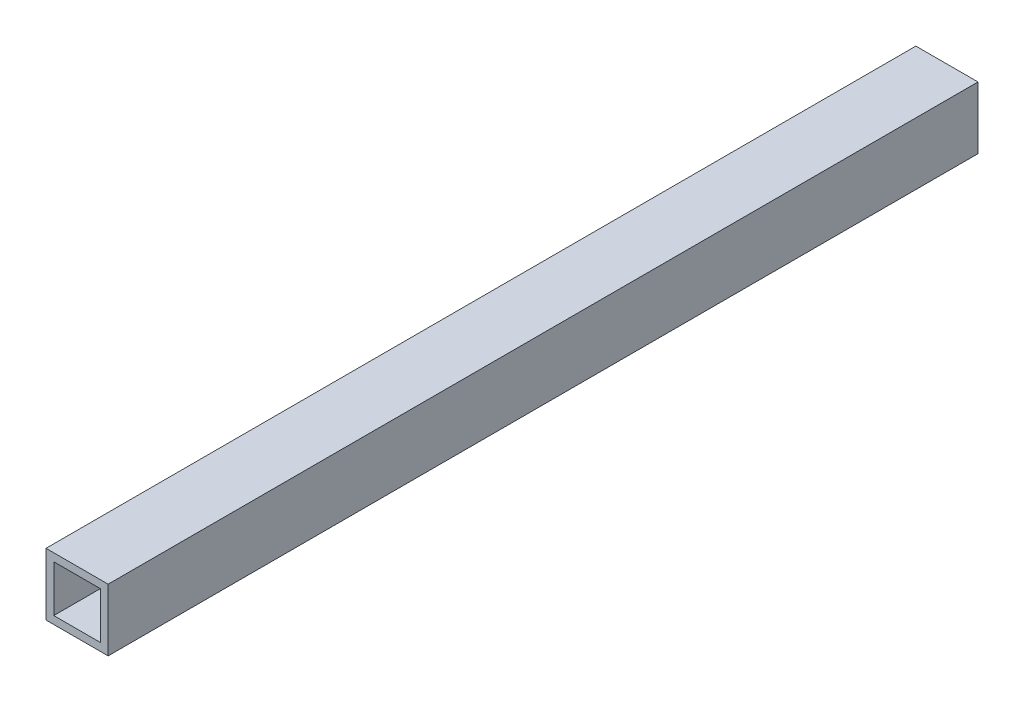
ISO-10303-21;
HEADER;
FILE_DESCRIPTION(('STEP AP214'),'2;1');
FILE_NAME('part.step','',(''),(''),'','','');
FILE_SCHEMA(('AUTOMOTIVE_DESIGN { 1 0 10303 214 1 1 1 1 }'));
ENDSEC;
DATA;
#1=APPLICATION_CONTEXT('core data for automotive mechanical design processes');
#2=APPLICATION_PROTOCOL_DEFINITION('international standard','automotive_design',2000,#1);
#3=PRODUCT_CONTEXT('',#1,'mechanical');
#4=PRODUCT('Part','Part','',(#3));
#5=PRODUCT_RELATED_PRODUCT_CATEGORY('part','',(#4));
#6=PRODUCT_DEFINITION_FORMATION('','',#4);
#7=PRODUCT_DEFINITION_CONTEXT('part definition',#1,'design');
#8=PRODUCT_DEFINITION('design','',#6,#7);
#9=PRODUCT_DEFINITION_SHAPE('','',#8);
#10=(LENGTH_UNIT() NAMED_UNIT(*) SI_UNIT(.MILLI.,.METRE.));
#11=(NAMED_UNIT(*) PLANE_ANGLE_UNIT() SI_UNIT($,.RADIAN.));
#12=(NAMED_UNIT(*) SI_UNIT($,.STERADIAN.) SOLID_ANGLE_UNIT());
#13=UNCERTAINTY_MEASURE_WITH_UNIT(LENGTH_MEASURE(1.E-05),#10,'distance_accuracy_value','');
#14=(GEOMETRIC_REPRESENTATION_CONTEXT(3) GLOBAL_UNCERTAINTY_ASSIGNED_CONTEXT((#13)) GLOBAL_UNIT_ASSIGNED_CONTEXT((#10,
#11,#12)) REPRESENTATION_CONTEXT('',''));
#15=CARTESIAN_POINT('',(0.,0.,0.));
#16=DIRECTION('',(0.,0.,1.));
#17=DIRECTION('',(1.,0.,0.));
#18=AXIS2_PLACEMENT_3D('',#15,#16,#17);
#19=CARTESIAN_POINT('',(0.,0.,177.8));
#20=DIRECTION('',(0.,0.,1.));
#21=DIRECTION('',(1.,0.,0.));
#22=AXIS2_PLACEMENT_3D('',#19,#20,#21);
#23=PLANE('',#22);
#24=DIRECTION('',(0.,-1.,0.));
#25=VECTOR('',#24,1.);
#26=CARTESIAN_POINT('',(-12.7,-12.7,177.8));
#27=LINE('',#26,#25);
#28=CARTESIAN_POINT('',(-12.7,12.7,177.8));
#29=VERTEX_POINT('',#28);
#30=CARTESIAN_POINT('',(-12.7,-12.7,177.8));
#31=VERTEX_POINT('',#30);
#32=EDGE_CURVE('E112',#29,#31,#27,.T.);
#33=ORIENTED_EDGE('',*,*,#32,.T.);
#34=DIRECTION('',(1.,0.,0.));
#35=VECTOR('',#34,1.);
#36=CARTESIAN_POINT('',(12.7,-12.7,177.8));
#37=LINE('',#36,#35);
#38=CARTESIAN_POINT('',(12.7,-12.7,177.8));
#39=VERTEX_POINT('',#38);
#40=EDGE_CURVE('E155',#31,#39,#37,.T.);
#41=ORIENTED_EDGE('',*,*,#40,.T.);
#42=DIRECTION('',(0.,1.,0.));
#43=VECTOR('',#42,1.);
#44=CARTESIAN_POINT('',(12.7,-12.7,177.8));
#45=LINE('',#44,#43);
#46=CARTESIAN_POINT('',(12.7,12.7,177.8));
#47=VERTEX_POINT('',#46);
#48=EDGE_CURVE('E157',#39,#47,#45,.T.);
#49=ORIENTED_EDGE('',*,*,#48,.T.);
#50=DIRECTION('',(-1.,0.,0.));
#51=VECTOR('',#50,1.);
#52=CARTESIAN_POINT('',(12.7,12.7,177.8));
#53=LINE('',#52,#51);
#54=EDGE_CURVE('E59',#47,#29,#53,.T.);
#55=ORIENTED_EDGE('',*,*,#54,.T.);
#56=EDGE_LOOP('',(#33,#41,#49,#55));
#57=FACE_BOUND('',#56,.T.);
#58=DIRECTION('',(1.,0.,0.));
#59=VECTOR('',#58,1.);
#60=CARTESIAN_POINT('',(9.525,-9.525,177.8));
#61=LINE('',#60,#59);
#62=CARTESIAN_POINT('',(-9.52499999999999,-9.525,177.8));
#63=VERTEX_POINT('',#62);
#64=CARTESIAN_POINT('',(9.525,-9.525,177.8));
#65=VERTEX_POINT('',#64);
#66=EDGE_CURVE('E144',#63,#65,#61,.T.);
#67=ORIENTED_EDGE('',*,*,#66,.F.);
#68=DIRECTION('',(0.,-1.,0.));
#69=VECTOR('',#68,1.);
#70=CARTESIAN_POINT('',(-9.52499999999999,-9.525,177.8));
#71=LINE('',#70,#69);
#72=CARTESIAN_POINT('',(-9.52499999999999,9.525,177.8));
#73=VERTEX_POINT('',#72);
#74=EDGE_CURVE('E109',#73,#63,#71,.T.);
#75=ORIENTED_EDGE('',*,*,#74,.F.);
#76=DIRECTION('',(-1.,0.,0.));
#77=VECTOR('',#76,1.);
#78=CARTESIAN_POINT('',(9.525,9.525,177.8));
#79=LINE('',#78,#77);
#80=CARTESIAN_POINT('',(9.525,9.525,177.8));
#81=VERTEX_POINT('',#80);
#82=EDGE_CURVE('E148',#81,#73,#79,.T.);
#83=ORIENTED_EDGE('',*,*,#82,.F.);
#84=DIRECTION('',(0.,1.,0.));
#85=VECTOR('',#84,1.);
#86=CARTESIAN_POINT('',(9.525,-9.525,177.8));
#87=LINE('',#86,#85);
#88=EDGE_CURVE('E146',#65,#81,#87,.T.);
#89=ORIENTED_EDGE('',*,*,#88,.F.);
#90=EDGE_LOOP('',(#67,#75,#83,#89));
#91=FACE_BOUND('',#90,.T.);
#92=ADVANCED_FACE('F36',(#57,#91),#23,.T.);
#93=CARTESIAN_POINT('',(-12.7,-12.7,177.8));
#94=DIRECTION('',(1.,0.,0.));
#95=DIRECTION('',(0.,0.,-1.));
#96=AXIS2_PLACEMENT_3D('',#93,#94,#95);
#97=PLANE('',#96);
#98=DIRECTION('',(0.,0.,-1.));
#99=VECTOR('',#98,1.);
#100=CARTESIAN_POINT('',(-12.7,12.7,177.8));
#101=LINE('',#100,#99);
#102=CARTESIAN_POINT('',(-12.7,12.7,-177.8));
#103=VERTEX_POINT('',#102);
#104=EDGE_CURVE('E160',#29,#103,#101,.T.);
#105=ORIENTED_EDGE('',*,*,#104,.T.);
#106=DIRECTION('',(0.,-1.,0.));
#107=VECTOR('',#106,1.);
#108=CARTESIAN_POINT('',(-12.7,-12.7,-177.8));
#109=LINE('',#108,#107);
#110=CARTESIAN_POINT('',(-12.7,-12.7,-177.8));
#111=VERTEX_POINT('',#110);
#112=EDGE_CURVE('E131',#103,#111,#109,.T.);
#113=ORIENTED_EDGE('',*,*,#112,.T.);
#114=DIRECTION('',(0.,0.,-1.));
#115=VECTOR('',#114,1.);
#116=CARTESIAN_POINT('',(-12.7,-12.7,177.8));
#117=LINE('',#116,#115);
#118=EDGE_CURVE('E11',#31,#111,#117,.T.);
#119=ORIENTED_EDGE('',*,*,#118,.F.);
#120=ORIENTED_EDGE('',*,*,#32,.F.);
#121=EDGE_LOOP('',(#105,#113,#119,#120));
#122=FACE_BOUND('',#121,.T.);
#123=ADVANCED_FACE('F38',(#122),#97,.F.);
#124=CARTESIAN_POINT('',(12.7,-12.7,177.8));
#125=DIRECTION('',(0.,1.,0.));
#126=DIRECTION('',(0.,0.,1.));
#127=AXIS2_PLACEMENT_3D('',#124,#125,#126);
#128=PLANE('',#127);
#129=ORIENTED_EDGE('',*,*,#118,.T.);
#130=DIRECTION('',(1.,0.,0.));
#131=VECTOR('',#130,1.);
#132=CARTESIAN_POINT('',(12.7,-12.7,-177.8));
#133=LINE('',#132,#131);
#134=CARTESIAN_POINT('',(12.7,-12.7,-177.8));
#135=VERTEX_POINT('',#134);
#136=EDGE_CURVE('E134',#111,#135,#133,.T.);
#137=ORIENTED_EDGE('',*,*,#136,.T.);
#138=DIRECTION('',(0.,0.,-1.));
#139=VECTOR('',#138,1.);
#140=CARTESIAN_POINT('',(12.7,-12.7,177.8));
#141=LINE('',#140,#139);
#142=EDGE_CURVE('E44',#39,#135,#141,.T.);
#143=ORIENTED_EDGE('',*,*,#142,.F.);
#144=ORIENTED_EDGE('',*,*,#40,.F.);
#145=EDGE_LOOP('',(#129,#137,#143,#144));
#146=FACE_BOUND('',#145,.T.);
#147=ADVANCED_FACE('F173',(#146),#128,.F.);
#148=CARTESIAN_POINT('',(12.7,-12.7,177.8));
#149=DIRECTION('',(-1.,0.,0.));
#150=DIRECTION('',(0.,0.,1.));
#151=AXIS2_PLACEMENT_3D('',#148,#149,#150);
#152=PLANE('',#151);
#153=ORIENTED_EDGE('',*,*,#142,.T.);
#154=DIRECTION('',(0.,1.,0.));
#155=VECTOR('',#154,1.);
#156=CARTESIAN_POINT('',(12.7,-12.7,-177.8));
#157=LINE('',#156,#155);
#158=CARTESIAN_POINT('',(12.7,12.7,-177.8));
#159=VERTEX_POINT('',#158);
#160=EDGE_CURVE('E137',#135,#159,#157,.T.);
#161=ORIENTED_EDGE('',*,*,#160,.T.);
#162=DIRECTION('',(0.,0.,-1.));
#163=VECTOR('',#162,1.);
#164=CARTESIAN_POINT('',(12.7,12.7,177.8));
#165=LINE('',#164,#163);
#166=EDGE_CURVE('E162',#47,#159,#165,.T.);
#167=ORIENTED_EDGE('',*,*,#166,.F.);
#168=ORIENTED_EDGE('',*,*,#48,.F.);
#169=EDGE_LOOP('',(#153,#161,#167,#168));
#170=FACE_BOUND('',#169,.T.);
#171=ADVANCED_FACE('F167',(#170),#152,.F.);
#172=CARTESIAN_POINT('',(12.7,12.7,177.8));
#173=DIRECTION('',(0.,-1.,0.));
#174=DIRECTION('',(0.,0.,-1.));
#175=AXIS2_PLACEMENT_3D('',#172,#173,#174);
#176=PLANE('',#175);
#177=ORIENTED_EDGE('',*,*,#166,.T.);
#178=DIRECTION('',(-1.,0.,0.));
#179=VECTOR('',#178,1.);
#180=CARTESIAN_POINT('',(12.7,12.7,-177.8));
#181=LINE('',#180,#179);
#182=EDGE_CURVE('E140',#159,#103,#181,.T.);
#183=ORIENTED_EDGE('',*,*,#182,.T.);
#184=ORIENTED_EDGE('',*,*,#104,.F.);
#185=ORIENTED_EDGE('',*,*,#54,.F.);
#186=EDGE_LOOP('',(#177,#183,#184,#185));
#187=FACE_BOUND('',#186,.T.);
#188=ADVANCED_FACE('F178',(#187),#176,.F.);
#189=CARTESIAN_POINT('',(-9.52499999999999,-9.525,177.8));
#190=DIRECTION('',(1.,0.,0.));
#191=DIRECTION('',(0.,0.,-1.));
#192=AXIS2_PLACEMENT_3D('',#189,#190,#191);
#193=PLANE('',#192);
#194=DIRECTION('',(0.,0.,-1.));
#195=VECTOR('',#194,1.);
#196=CARTESIAN_POINT('',(-9.52499999999999,-9.525,177.8));
#197=LINE('',#196,#195);
#198=CARTESIAN_POINT('',(-9.52499999999999,-9.525,-177.8));
#199=VERTEX_POINT('',#198);
#200=EDGE_CURVE('E101',#63,#199,#197,.T.);
#201=ORIENTED_EDGE('',*,*,#200,.T.);
#202=DIRECTION('',(0.,-1.,0.));
#203=VECTOR('',#202,1.);
#204=CARTESIAN_POINT('',(-9.52499999999999,-9.525,-177.8));
#205=LINE('',#204,#203);
#206=CARTESIAN_POINT('',(-9.52499999999999,9.525,-177.8));
#207=VERTEX_POINT('',#206);
#208=EDGE_CURVE('E106',#207,#199,#205,.T.);
#209=ORIENTED_EDGE('',*,*,#208,.F.);
#210=DIRECTION('',(0.,0.,-1.));
#211=VECTOR('',#210,1.);
#212=CARTESIAN_POINT('',(-9.52499999999999,9.525,177.8));
#213=LINE('',#212,#211);
#214=EDGE_CURVE('E150',#73,#207,#213,.T.);
#215=ORIENTED_EDGE('',*,*,#214,.F.);
#216=ORIENTED_EDGE('',*,*,#74,.T.);
#217=EDGE_LOOP('',(#201,#209,#215,#216));
#218=FACE_BOUND('',#217,.T.);
#219=ADVANCED_FACE('F103',(#218),#193,.T.);
#220=CARTESIAN_POINT('',(9.525,-9.525,177.8));
#221=DIRECTION('',(0.,1.,0.));
#222=DIRECTION('',(0.,0.,1.));
#223=AXIS2_PLACEMENT_3D('',#220,#221,#222);
#224=PLANE('',#223);
#225=DIRECTION('',(0.,0.,-1.));
#226=VECTOR('',#225,1.);
#227=CARTESIAN_POINT('',(9.525,-9.525,177.8));
#228=LINE('',#227,#226);
#229=CARTESIAN_POINT('',(9.525,-9.525,-177.8));
#230=VERTEX_POINT('',#229);
#231=EDGE_CURVE('E113',#65,#230,#228,.T.);
#232=ORIENTED_EDGE('',*,*,#231,.T.);
#233=DIRECTION('',(1.,0.,0.));
#234=VECTOR('',#233,1.);
#235=CARTESIAN_POINT('',(9.525,-9.525,-177.8));
#236=LINE('',#235,#234);
#237=EDGE_CURVE('E116',#199,#230,#236,.T.);
#238=ORIENTED_EDGE('',*,*,#237,.F.);
#239=ORIENTED_EDGE('',*,*,#200,.F.);
#240=ORIENTED_EDGE('',*,*,#66,.T.);
#241=EDGE_LOOP('',(#232,#238,#239,#240));
#242=FACE_BOUND('',#241,.T.);
#243=ADVANCED_FACE('F117',(#242),#224,.T.);
#244=CARTESIAN_POINT('',(9.525,-9.525,177.8));
#245=DIRECTION('',(-1.,0.,0.));
#246=DIRECTION('',(0.,0.,1.));
#247=AXIS2_PLACEMENT_3D('',#244,#245,#246);
#248=PLANE('',#247);
#249=DIRECTION('',(0.,0.,-1.));
#250=VECTOR('',#249,1.);
#251=CARTESIAN_POINT('',(9.525,9.525,177.8));
#252=LINE('',#251,#250);
#253=CARTESIAN_POINT('',(9.525,9.525,-177.8));
#254=VERTEX_POINT('',#253);
#255=EDGE_CURVE('E51',#81,#254,#252,.T.);
#256=ORIENTED_EDGE('',*,*,#255,.T.);
#257=DIRECTION('',(0.,1.,0.));
#258=VECTOR('',#257,1.);
#259=CARTESIAN_POINT('',(9.525,-9.525,-177.8));
#260=LINE('',#259,#258);
#261=EDGE_CURVE('E122',#230,#254,#260,.T.);
#262=ORIENTED_EDGE('',*,*,#261,.F.);
#263=ORIENTED_EDGE('',*,*,#231,.F.);
#264=ORIENTED_EDGE('',*,*,#88,.T.);
#265=EDGE_LOOP('',(#256,#262,#263,#264));
#266=FACE_BOUND('',#265,.T.);
#267=ADVANCED_FACE('F196',(#266),#248,.T.);
#268=CARTESIAN_POINT('',(9.525,9.525,177.8));
#269=DIRECTION('',(0.,-1.,0.));
#270=DIRECTION('',(0.,0.,-1.));
#271=AXIS2_PLACEMENT_3D('',#268,#269,#270);
#272=PLANE('',#271);
#273=ORIENTED_EDGE('',*,*,#214,.T.);
#274=DIRECTION('',(-1.,0.,0.));
#275=VECTOR('',#274,1.);
#276=CARTESIAN_POINT('',(9.525,9.525,-177.8));
#277=LINE('',#276,#275);
#278=EDGE_CURVE('E126',#254,#207,#277,.T.);
#279=ORIENTED_EDGE('',*,*,#278,.F.);
#280=ORIENTED_EDGE('',*,*,#255,.F.);
#281=ORIENTED_EDGE('',*,*,#82,.T.);
#282=EDGE_LOOP('',(#273,#279,#280,#281));
#283=FACE_BOUND('',#282,.T.);
#284=ADVANCED_FACE('F199',(#283),#272,.T.);
#285=CARTESIAN_POINT('',(0.,0.,-177.8));
#286=DIRECTION('',(0.,0.,1.));
#287=DIRECTION('',(1.,0.,0.));
#288=AXIS2_PLACEMENT_3D('',#285,#286,#287);
#289=PLANE('',#288);
#290=ORIENTED_EDGE('',*,*,#278,.T.);
#291=ORIENTED_EDGE('',*,*,#208,.T.);
#292=ORIENTED_EDGE('',*,*,#237,.T.);
#293=ORIENTED_EDGE('',*,*,#261,.T.);
#294=EDGE_LOOP('',(#290,#291,#292,#293));
#295=FACE_BOUND('',#294,.T.);
#296=ORIENTED_EDGE('',*,*,#112,.F.);
#297=ORIENTED_EDGE('',*,*,#182,.F.);
#298=ORIENTED_EDGE('',*,*,#160,.F.);
#299=ORIENTED_EDGE('',*,*,#136,.F.);
#300=EDGE_LOOP('',(#296,#297,#298,#299));
#301=FACE_BOUND('',#300,.T.);
#302=ADVANCED_FACE('F124',(#295,#301),#289,.F.);
#303=CLOSED_SHELL('',(#92,#123,#147,#171,#188,#219,#243,#267,#284,#302));
#304=MANIFOLD_SOLID_BREP('B2',#303);
#305=ADVANCED_BREP_SHAPE_REPRESENTATION('',(#18,#304),#14);
#306=SHAPE_DEFINITION_REPRESENTATION(#9,#305);
ENDSEC;
END-ISO-10303-21;
